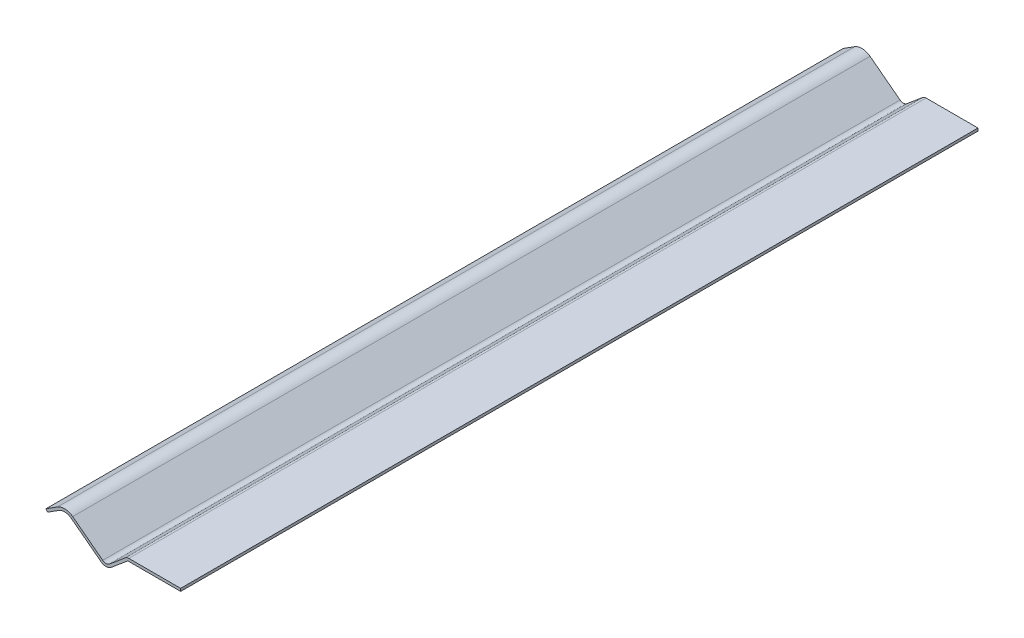
ISO-10303-21;
HEADER;
FILE_DESCRIPTION(('STEP AP214'),'2;1');
FILE_NAME('part.step','',(''),(''),'','','');
FILE_SCHEMA(('AUTOMOTIVE_DESIGN { 1 0 10303 214 1 1 1 1 }'));
ENDSEC;
DATA;
#1=APPLICATION_CONTEXT('core data for automotive mechanical design processes');
#2=APPLICATION_PROTOCOL_DEFINITION('international standard','automotive_design',2000,#1);
#3=PRODUCT_CONTEXT('',#1,'mechanical');
#4=PRODUCT('Part','Part','',(#3));
#5=PRODUCT_RELATED_PRODUCT_CATEGORY('part','',(#4));
#6=PRODUCT_DEFINITION_FORMATION('','',#4);
#7=PRODUCT_DEFINITION_CONTEXT('part definition',#1,'design');
#8=PRODUCT_DEFINITION('design','',#6,#7);
#9=PRODUCT_DEFINITION_SHAPE('','',#8);
#10=(LENGTH_UNIT() NAMED_UNIT(*) SI_UNIT(.MILLI.,.METRE.));
#11=(NAMED_UNIT(*) PLANE_ANGLE_UNIT() SI_UNIT($,.RADIAN.));
#12=(NAMED_UNIT(*) SI_UNIT($,.STERADIAN.) SOLID_ANGLE_UNIT());
#13=UNCERTAINTY_MEASURE_WITH_UNIT(LENGTH_MEASURE(1.E-05),#10,'distance_accuracy_value','');
#14=(GEOMETRIC_REPRESENTATION_CONTEXT(3) GLOBAL_UNCERTAINTY_ASSIGNED_CONTEXT((#13)) GLOBAL_UNIT_ASSIGNED_CONTEXT((#10,
#11,#12)) REPRESENTATION_CONTEXT('',''));
#15=CARTESIAN_POINT('',(0.,0.,0.));
#16=DIRECTION('',(0.,0.,1.));
#17=DIRECTION('',(1.,0.,0.));
#18=AXIS2_PLACEMENT_3D('',#15,#16,#17);
#19=CARTESIAN_POINT('',(-11.5501046787305,-0.477822668111692,74.));
#20=DIRECTION('',(0.,0.,-1.));
#21=DIRECTION('',(-1.,0.,0.));
#22=AXIS2_PLACEMENT_3D('',#19,#20,#21);
#23=CYLINDRICAL_SURFACE('',#22,2.5);
#24=CARTESIAN_POINT('',(-11.5501046787305,-0.477822668111692,-74.));
#25=DIRECTION('',(0.,0.,1.));
#26=DIRECTION('',(1.,0.,0.));
#27=AXIS2_PLACEMENT_3D('',#24,#25,#26);
#28=CIRCLE('',#27,2.5);
#29=CARTESIAN_POINT('',(-10.035554943505,1.51118188178971,-74.));
#30=VERTEX_POINT('',#29);
#31=CARTESIAN_POINT('',(-12.8883281895237,1.6338491423646,-74.));
#32=VERTEX_POINT('',#31);
#33=EDGE_CURVE('E180',#30,#32,#28,.T.);
#34=ORIENTED_EDGE('',*,*,#33,.T.);
#35=DIRECTION('',(0.,0.,-1.));
#36=VECTOR('',#35,1.);
#37=CARTESIAN_POINT('',(-12.8883281895237,1.6338491423646,74.));
#38=LINE('',#37,#36);
#39=CARTESIAN_POINT('',(-12.8883281895237,1.6338491423646,74.));
#40=VERTEX_POINT('',#39);
#41=EDGE_CURVE('E11',#40,#32,#38,.T.);
#42=ORIENTED_EDGE('',*,*,#41,.F.);
#43=CARTESIAN_POINT('',(-11.5501046787305,-0.477822668111692,74.));
#44=DIRECTION('',(0.,0.,1.));
#45=DIRECTION('',(1.,0.,0.));
#46=AXIS2_PLACEMENT_3D('',#43,#44,#45);
#47=CIRCLE('',#46,2.5);
#48=CARTESIAN_POINT('',(-10.035554943505,1.51118188178971,74.));
#49=VERTEX_POINT('',#48);
#50=EDGE_CURVE('E219',#49,#40,#47,.T.);
#51=ORIENTED_EDGE('',*,*,#50,.F.);
#52=DIRECTION('',(0.,0.,-1.));
#53=VECTOR('',#52,1.);
#54=CARTESIAN_POINT('',(-10.035554943505,1.51118188178971,74.));
#55=LINE('',#54,#53);
#56=EDGE_CURVE('E176',#49,#30,#55,.T.);
#57=ORIENTED_EDGE('',*,*,#56,.T.);
#58=EDGE_LOOP('',(#34,#42,#51,#57));
#59=FACE_BOUND('',#58,.T.);
#60=ADVANCED_FACE('F36',(#59),#23,.T.);
#61=CARTESIAN_POINT('',(-12.8883281895237,1.6338491423646,74.));
#62=DIRECTION('',(0.535289404317296,-0.844668724190516,0.));
#63=DIRECTION('',(0.844668724190516,0.535289404317296,0.));
#64=AXIS2_PLACEMENT_3D('',#61,#62,#63);
#65=PLANE('',#64);
#66=DIRECTION('',(-0.844668724190516,-0.535289404317296,0.));
#67=VECTOR('',#66,1.);
#68=CARTESIAN_POINT('',(-12.8883281895237,1.6338491423646,-74.));
#69=LINE('',#68,#67);
#70=CARTESIAN_POINT('',(-15.,0.29562563157136,-74.));
#71=VERTEX_POINT('',#70);
#72=EDGE_CURVE('E183',#32,#71,#69,.T.);
#73=ORIENTED_EDGE('',*,*,#72,.T.);
#74=DIRECTION('',(0.,0.,-1.));
#75=VECTOR('',#74,1.);
#76=CARTESIAN_POINT('',(-15.,0.29562563157136,74.));
#77=LINE('',#76,#75);
#78=CARTESIAN_POINT('',(-15.,0.29562563157136,74.));
#79=VERTEX_POINT('',#78);
#80=EDGE_CURVE('E44',#79,#71,#77,.T.);
#81=ORIENTED_EDGE('',*,*,#80,.F.);
#82=DIRECTION('',(-0.844668724190516,-0.535289404317296,0.));
#83=VECTOR('',#82,1.);
#84=CARTESIAN_POINT('',(-12.8883281895237,1.6338491423646,74.));
#85=LINE('',#84,#83);
#86=EDGE_CURVE('E119',#40,#79,#85,.T.);
#87=ORIENTED_EDGE('',*,*,#86,.F.);
#88=ORIENTED_EDGE('',*,*,#41,.T.);
#89=EDGE_LOOP('',(#73,#81,#87,#88));
#90=FACE_BOUND('',#89,.T.);
#91=ADVANCED_FACE('F311',(#90),#65,.F.);
#92=CARTESIAN_POINT('',(-15.,0.29562563157136,74.));
#93=DIRECTION('',(0.844668724190516,0.535289404317296,0.));
#94=DIRECTION('',(-0.535289404317296,0.844668724190516,0.));
#95=AXIS2_PLACEMENT_3D('',#92,#93,#94);
#96=PLANE('',#95);
#97=DIRECTION('',(0.535289404317296,-0.844668724190516,0.));
#98=VECTOR('',#97,1.);
#99=CARTESIAN_POINT('',(-15.,0.29562563157136,-74.));
#100=LINE('',#99,#98);
#101=CARTESIAN_POINT('',(-14.7323552978413,-0.126708730523898,-74.));
#102=VERTEX_POINT('',#101);
#103=EDGE_CURVE('E185',#71,#102,#100,.T.);
#104=ORIENTED_EDGE('',*,*,#103,.T.);
#105=DIRECTION('',(0.,0.,-1.));
#106=VECTOR('',#105,1.);
#107=CARTESIAN_POINT('',(-14.7323552978413,-0.126708730523898,74.));
#108=LINE('',#107,#106);
#109=CARTESIAN_POINT('',(-14.7323552978413,-0.126708730523898,74.));
#110=VERTEX_POINT('',#109);
#111=EDGE_CURVE('E242',#110,#102,#108,.T.);
#112=ORIENTED_EDGE('',*,*,#111,.F.);
#113=DIRECTION('',(0.535289404317296,-0.844668724190516,0.));
#114=VECTOR('',#113,1.);
#115=CARTESIAN_POINT('',(-15.,0.29562563157136,74.));
#116=LINE('',#115,#114);
#117=EDGE_CURVE('E249',#79,#110,#116,.T.);
#118=ORIENTED_EDGE('',*,*,#117,.F.);
#119=ORIENTED_EDGE('',*,*,#80,.T.);
#120=EDGE_LOOP('',(#104,#112,#118,#119));
#121=FACE_BOUND('',#120,.T.);
#122=ADVANCED_FACE('F247',(#121),#96,.F.);
#123=CARTESIAN_POINT('',(-12.6206834873651,1.21151478026934,74.));
#124=DIRECTION('',(0.535289404317297,-0.844668724190516,0.));
#125=DIRECTION('',(0.844668724190516,0.535289404317297,0.));
#126=AXIS2_PLACEMENT_3D('',#123,#124,#125);
#127=PLANE('',#126);
#128=DIRECTION('',(-0.844668724190516,-0.535289404317297,0.));
#129=VECTOR('',#128,1.);
#130=CARTESIAN_POINT('',(-12.6206834873651,1.21151478026934,-74.));
#131=LINE('',#130,#129);
#132=CARTESIAN_POINT('',(-12.6206834873651,1.21151478026934,-74.));
#133=VERTEX_POINT('',#132);
#134=EDGE_CURVE('E188',#133,#102,#131,.T.);
#135=ORIENTED_EDGE('',*,*,#134,.F.);
#136=DIRECTION('',(0.,0.,-1.));
#137=VECTOR('',#136,1.);
#138=CARTESIAN_POINT('',(-12.6206834873651,1.21151478026934,74.));
#139=LINE('',#138,#137);
#140=CARTESIAN_POINT('',(-12.6206834873651,1.21151478026934,74.));
#141=VERTEX_POINT('',#140);
#142=EDGE_CURVE('E240',#141,#133,#139,.T.);
#143=ORIENTED_EDGE('',*,*,#142,.F.);
#144=DIRECTION('',(-0.844668724190516,-0.535289404317297,0.));
#145=VECTOR('',#144,1.);
#146=CARTESIAN_POINT('',(-12.6206834873651,1.21151478026934,74.));
#147=LINE('',#146,#145);
#148=EDGE_CURVE('E259',#141,#110,#147,.T.);
#149=ORIENTED_EDGE('',*,*,#148,.T.);
#150=ORIENTED_EDGE('',*,*,#111,.T.);
#151=EDGE_LOOP('',(#135,#143,#149,#150));
#152=FACE_BOUND('',#151,.T.);
#153=ADVANCED_FACE('F256',(#152),#127,.T.);
#154=CARTESIAN_POINT('',(-11.5501046787305,-0.477822668111692,74.));
#155=DIRECTION('',(0.,0.,-1.));
#156=DIRECTION('',(-1.,0.,0.));
#157=AXIS2_PLACEMENT_3D('',#154,#155,#156);
#158=CYLINDRICAL_SURFACE('',#157,2.);
#159=CARTESIAN_POINT('',(-11.5501046787305,-0.477822668111692,-74.));
#160=DIRECTION('',(0.,0.,1.));
#161=DIRECTION('',(1.,0.,0.));
#162=AXIS2_PLACEMENT_3D('',#159,#160,#161);
#163=CIRCLE('',#162,2.);
#164=CARTESIAN_POINT('',(-10.3384648905501,1.11338097180943,-74.));
#165=VERTEX_POINT('',#164);
#166=EDGE_CURVE('E191',#165,#133,#163,.T.);
#167=ORIENTED_EDGE('',*,*,#166,.F.);
#168=DIRECTION('',(0.,0.,-1.));
#169=VECTOR('',#168,1.);
#170=CARTESIAN_POINT('',(-10.3384648905501,1.11338097180943,74.));
#171=LINE('',#170,#169);
#172=CARTESIAN_POINT('',(-10.3384648905501,1.11338097180943,74.));
#173=VERTEX_POINT('',#172);
#174=EDGE_CURVE('E238',#173,#165,#171,.T.);
#175=ORIENTED_EDGE('',*,*,#174,.F.);
#176=CARTESIAN_POINT('',(-11.5501046787305,-0.477822668111692,74.));
#177=DIRECTION('',(0.,0.,1.));
#178=DIRECTION('',(1.,0.,0.));
#179=AXIS2_PLACEMENT_3D('',#176,#177,#178);
#180=CIRCLE('',#179,2.);
#181=EDGE_CURVE('E262',#173,#141,#180,.T.);
#182=ORIENTED_EDGE('',*,*,#181,.T.);
#183=ORIENTED_EDGE('',*,*,#142,.T.);
#184=EDGE_LOOP('',(#167,#175,#182,#183));
#185=FACE_BOUND('',#184,.T.);
#186=ADVANCED_FACE('F322',(#185),#158,.F.);
#187=CARTESIAN_POINT('',(-4.76925215082618,-3.12735828682187,74.));
#188=DIRECTION('',(-0.605819894090186,-0.795601819960561,0.));
#189=DIRECTION('',(0.795601819960561,-0.605819894090186,0.));
#190=AXIS2_PLACEMENT_3D('',#187,#188,#189);
#191=PLANE('',#190);
#192=DIRECTION('',(-0.795601819960561,0.605819894090186,0.));
#193=VECTOR('',#192,1.);
#194=CARTESIAN_POINT('',(-4.76925215082618,-3.12735828682187,-74.));
#195=LINE('',#194,#193);
#196=CARTESIAN_POINT('',(-4.76925215082618,-3.12735828682187,-74.));
#197=VERTEX_POINT('',#196);
#198=EDGE_CURVE('E194',#197,#165,#195,.T.);
#199=ORIENTED_EDGE('',*,*,#198,.F.);
#200=DIRECTION('',(0.,0.,-1.));
#201=VECTOR('',#200,1.);
#202=CARTESIAN_POINT('',(-4.76925215082618,-3.12735828682187,74.));
#203=LINE('',#202,#201);
#204=CARTESIAN_POINT('',(-4.76925215082618,-3.12735828682187,74.));
#205=VERTEX_POINT('',#204);
#206=EDGE_CURVE('E236',#205,#197,#203,.T.);
#207=ORIENTED_EDGE('',*,*,#206,.F.);
#208=DIRECTION('',(-0.795601819960561,0.605819894090186,0.));
#209=VECTOR('',#208,1.);
#210=CARTESIAN_POINT('',(-4.76925215082618,-3.12735828682187,74.));
#211=LINE('',#210,#209);
#212=EDGE_CURVE('E264',#205,#173,#211,.T.);
#213=ORIENTED_EDGE('',*,*,#212,.T.);
#214=ORIENTED_EDGE('',*,*,#174,.T.);
#215=EDGE_LOOP('',(#199,#207,#213,#214));
#216=FACE_BOUND('',#215,.T.);
#217=ADVANCED_FACE('F325',(#216),#191,.T.);
#218=CARTESIAN_POINT('',(-3.8605223096909,-1.93395555688102,74.));
#219=DIRECTION('',(0.,0.,-1.));
#220=DIRECTION('',(-1.,0.,0.));
#221=AXIS2_PLACEMENT_3D('',#218,#219,#220);
#222=CYLINDRICAL_SURFACE('',#221,1.5);
#223=CARTESIAN_POINT('',(-3.8605223096909,-1.93395555688102,-74.));
#224=DIRECTION('',(0.,0.,-1.));
#225=DIRECTION('',(-1.,0.,0.));
#226=AXIS2_PLACEMENT_3D('',#223,#224,#225);
#227=CIRCLE('',#226,1.5);
#228=CARTESIAN_POINT('',(-2.89634089516109,-3.08302222155949,-74.));
#229=VERTEX_POINT('',#228);
#230=EDGE_CURVE('E197',#229,#197,#227,.T.);
#231=ORIENTED_EDGE('',*,*,#230,.F.);
#232=DIRECTION('',(0.,0.,-1.));
#233=VECTOR('',#232,1.);
#234=CARTESIAN_POINT('',(-2.89634089516109,-3.08302222155949,74.));
#235=LINE('',#234,#233);
#236=CARTESIAN_POINT('',(-2.89634089516109,-3.08302222155949,74.));
#237=VERTEX_POINT('',#236);
#238=EDGE_CURVE('E234',#237,#229,#235,.T.);
#239=ORIENTED_EDGE('',*,*,#238,.F.);
#240=CARTESIAN_POINT('',(-3.8605223096909,-1.93395555688102,74.));
#241=DIRECTION('',(0.,0.,-1.));
#242=DIRECTION('',(-1.,0.,0.));
#243=AXIS2_PLACEMENT_3D('',#240,#241,#242);
#244=CIRCLE('',#243,1.5);
#245=EDGE_CURVE('E271',#237,#205,#244,.T.);
#246=ORIENTED_EDGE('',*,*,#245,.T.);
#247=ORIENTED_EDGE('',*,*,#206,.T.);
#248=EDGE_LOOP('',(#231,#239,#246,#247));
#249=FACE_BOUND('',#248,.T.);
#250=ADVANCED_FACE('F329',(#249),#222,.T.);
#251=CARTESIAN_POINT('',(0.0425764294229316,-0.616977778440512,74.));
#252=DIRECTION('',(0.64278760968654,-0.766044443118977,0.));
#253=DIRECTION('',(0.766044443118977,0.64278760968654,0.));
#254=AXIS2_PLACEMENT_3D('',#251,#252,#253);
#255=PLANE('',#254);
#256=DIRECTION('',(-0.766044443118977,-0.64278760968654,0.));
#257=VECTOR('',#256,1.);
#258=CARTESIAN_POINT('',(0.0425764294229316,-0.616977778440512,-74.));
#259=LINE('',#258,#257);
#260=CARTESIAN_POINT('',(0.0425764294229316,-0.616977778440512,-74.));
#261=VERTEX_POINT('',#260);
#262=EDGE_CURVE('E200',#261,#229,#259,.T.);
#263=ORIENTED_EDGE('',*,*,#262,.F.);
#264=DIRECTION('',(0.,0.,-1.));
#265=VECTOR('',#264,1.);
#266=CARTESIAN_POINT('',(0.0425764294229316,-0.616977778440512,74.));
#267=LINE('',#266,#265);
#268=CARTESIAN_POINT('',(0.0425764294229316,-0.616977778440512,74.));
#269=VERTEX_POINT('',#268);
#270=EDGE_CURVE('E232',#269,#261,#267,.T.);
#271=ORIENTED_EDGE('',*,*,#270,.F.);
#272=DIRECTION('',(-0.766044443118977,-0.64278760968654,0.));
#273=VECTOR('',#272,1.);
#274=CARTESIAN_POINT('',(0.0425764294229316,-0.616977778440512,74.));
#275=LINE('',#274,#273);
#276=EDGE_CURVE('E274',#269,#237,#275,.T.);
#277=ORIENTED_EDGE('',*,*,#276,.T.);
#278=ORIENTED_EDGE('',*,*,#238,.T.);
#279=EDGE_LOOP('',(#263,#271,#277,#278));
#280=FACE_BOUND('',#279,.T.);
#281=ADVANCED_FACE('F333',(#280),#255,.T.);
#282=CARTESIAN_POINT('',(0.363970234266202,-1.,74.));
#283=DIRECTION('',(0.,0.,-1.));
#284=DIRECTION('',(-1.,0.,0.));
#285=AXIS2_PLACEMENT_3D('',#282,#283,#284);
#286=CYLINDRICAL_SURFACE('',#285,0.5);
#287=CARTESIAN_POINT('',(0.363970234266202,-1.,-74.));
#288=DIRECTION('',(0.,0.,1.));
#289=DIRECTION('',(1.,0.,0.));
#290=AXIS2_PLACEMENT_3D('',#287,#288,#289);
#291=CIRCLE('',#290,0.5);
#292=CARTESIAN_POINT('',(0.363970234266202,-0.500000000000001,-74.));
#293=VERTEX_POINT('',#292);
#294=EDGE_CURVE('E203',#293,#261,#291,.T.);
#295=ORIENTED_EDGE('',*,*,#294,.F.);
#296=DIRECTION('',(0.,0.,-1.));
#297=VECTOR('',#296,1.);
#298=CARTESIAN_POINT('',(0.363970234266202,-0.500000000000001,74.));
#299=LINE('',#298,#297);
#300=CARTESIAN_POINT('',(0.363970234266202,-0.500000000000001,74.));
#301=VERTEX_POINT('',#300);
#302=EDGE_CURVE('E230',#301,#293,#299,.T.);
#303=ORIENTED_EDGE('',*,*,#302,.F.);
#304=CARTESIAN_POINT('',(0.363970234266202,-1.,74.));
#305=DIRECTION('',(0.,0.,1.));
#306=DIRECTION('',(1.,0.,0.));
#307=AXIS2_PLACEMENT_3D('',#304,#305,#306);
#308=CIRCLE('',#307,0.5);
#309=EDGE_CURVE('E277',#301,#269,#308,.T.);
#310=ORIENTED_EDGE('',*,*,#309,.T.);
#311=ORIENTED_EDGE('',*,*,#270,.T.);
#312=EDGE_LOOP('',(#295,#303,#310,#311));
#313=FACE_BOUND('',#312,.T.);
#314=ADVANCED_FACE('F337',(#313),#286,.F.);
#315=CARTESIAN_POINT('',(10.,-0.5,74.));
#316=DIRECTION('',(0.,-1.,0.));
#317=DIRECTION('',(1.,0.,0.));
#318=AXIS2_PLACEMENT_3D('',#315,#316,#317);
#319=PLANE('',#318);
#320=DIRECTION('',(-1.,0.,0.));
#321=VECTOR('',#320,1.);
#322=CARTESIAN_POINT('',(10.,-0.5,-74.));
#323=LINE('',#322,#321);
#324=CARTESIAN_POINT('',(10.,-0.5,-74.));
#325=VERTEX_POINT('',#324);
#326=EDGE_CURVE('E206',#325,#293,#323,.T.);
#327=ORIENTED_EDGE('',*,*,#326,.F.);
#328=DIRECTION('',(0.,0.,-1.));
#329=VECTOR('',#328,1.);
#330=CARTESIAN_POINT('',(10.,-0.5,74.));
#331=LINE('',#330,#329);
#332=CARTESIAN_POINT('',(10.,-0.5,74.));
#333=VERTEX_POINT('',#332);
#334=EDGE_CURVE('E228',#333,#325,#331,.T.);
#335=ORIENTED_EDGE('',*,*,#334,.F.);
#336=DIRECTION('',(-1.,0.,0.));
#337=VECTOR('',#336,1.);
#338=CARTESIAN_POINT('',(10.,-0.5,74.));
#339=LINE('',#338,#337);
#340=EDGE_CURVE('E280',#333,#301,#339,.T.);
#341=ORIENTED_EDGE('',*,*,#340,.T.);
#342=ORIENTED_EDGE('',*,*,#302,.T.);
#343=EDGE_LOOP('',(#327,#335,#341,#342));
#344=FACE_BOUND('',#343,.T.);
#345=ADVANCED_FACE('F341',(#344),#319,.T.);
#346=CARTESIAN_POINT('',(10.,0.,74.));
#347=DIRECTION('',(1.,0.,0.));
#348=DIRECTION('',(0.,1.,0.));
#349=AXIS2_PLACEMENT_3D('',#346,#347,#348);
#350=PLANE('',#349);
#351=DIRECTION('',(0.,-1.,0.));
#352=VECTOR('',#351,1.);
#353=CARTESIAN_POINT('',(10.,0.,-74.));
#354=LINE('',#353,#352);
#355=CARTESIAN_POINT('',(10.,0.,-74.));
#356=VERTEX_POINT('',#355);
#357=EDGE_CURVE('E209',#356,#325,#354,.T.);
#358=ORIENTED_EDGE('',*,*,#357,.F.);
#359=DIRECTION('',(0.,0.,-1.));
#360=VECTOR('',#359,1.);
#361=CARTESIAN_POINT('',(10.,0.,74.));
#362=LINE('',#361,#360);
#363=CARTESIAN_POINT('',(10.,0.,74.));
#364=VERTEX_POINT('',#363);
#365=EDGE_CURVE('E226',#364,#356,#362,.T.);
#366=ORIENTED_EDGE('',*,*,#365,.F.);
#367=DIRECTION('',(0.,-1.,0.));
#368=VECTOR('',#367,1.);
#369=CARTESIAN_POINT('',(10.,0.,74.));
#370=LINE('',#369,#368);
#371=EDGE_CURVE('E283',#364,#333,#370,.T.);
#372=ORIENTED_EDGE('',*,*,#371,.T.);
#373=ORIENTED_EDGE('',*,*,#334,.T.);
#374=EDGE_LOOP('',(#358,#366,#372,#373));
#375=FACE_BOUND('',#374,.T.);
#376=ADVANCED_FACE('F345',(#375),#350,.T.);
#377=CARTESIAN_POINT('',(10.,0.,74.));
#378=DIRECTION('',(0.,-1.,0.));
#379=DIRECTION('',(1.,0.,0.));
#380=AXIS2_PLACEMENT_3D('',#377,#378,#379);
#381=PLANE('',#380);
#382=DIRECTION('',(-1.,0.,0.));
#383=VECTOR('',#382,1.);
#384=CARTESIAN_POINT('',(10.,0.,-74.));
#385=LINE('',#384,#383);
#386=CARTESIAN_POINT('',(0.363970234266202,0.,-74.));
#387=VERTEX_POINT('',#386);
#388=EDGE_CURVE('E212',#356,#387,#385,.T.);
#389=ORIENTED_EDGE('',*,*,#388,.T.);
#390=DIRECTION('',(0.,0.,-1.));
#391=VECTOR('',#390,1.);
#392=CARTESIAN_POINT('',(0.363970234266202,0.,74.));
#393=LINE('',#392,#391);
#394=CARTESIAN_POINT('',(0.363970234266202,0.,74.));
#395=VERTEX_POINT('',#394);
#396=EDGE_CURVE('E223',#395,#387,#393,.T.);
#397=ORIENTED_EDGE('',*,*,#396,.F.);
#398=DIRECTION('',(-1.,0.,0.));
#399=VECTOR('',#398,1.);
#400=CARTESIAN_POINT('',(10.,0.,74.));
#401=LINE('',#400,#399);
#402=EDGE_CURVE('E286',#364,#395,#401,.T.);
#403=ORIENTED_EDGE('',*,*,#402,.F.);
#404=ORIENTED_EDGE('',*,*,#365,.T.);
#405=EDGE_LOOP('',(#389,#397,#403,#404));
#406=FACE_BOUND('',#405,.T.);
#407=ADVANCED_FACE('F292',(#406),#381,.F.);
#408=CARTESIAN_POINT('',(0.363970234266202,-1.,74.));
#409=DIRECTION('',(0.,0.,-1.));
#410=DIRECTION('',(-1.,0.,0.));
#411=AXIS2_PLACEMENT_3D('',#408,#409,#410);
#412=CYLINDRICAL_SURFACE('',#411,1.);
#413=CARTESIAN_POINT('',(0.363970234266202,-1.,-74.));
#414=DIRECTION('',(0.,0.,1.));
#415=DIRECTION('',(1.,0.,0.));
#416=AXIS2_PLACEMENT_3D('',#413,#414,#415);
#417=CIRCLE('',#416,1.);
#418=CARTESIAN_POINT('',(-0.278817375420339,-0.233955556881024,-74.));
#419=VERTEX_POINT('',#418);
#420=EDGE_CURVE('E214',#387,#419,#417,.T.);
#421=ORIENTED_EDGE('',*,*,#420,.T.);
#422=DIRECTION('',(0.,0.,-1.));
#423=VECTOR('',#422,1.);
#424=CARTESIAN_POINT('',(-0.278817375420339,-0.233955556881024,74.));
#425=LINE('',#424,#423);
#426=CARTESIAN_POINT('',(-0.278817375420339,-0.233955556881024,74.));
#427=VERTEX_POINT('',#426);
#428=EDGE_CURVE('E171',#427,#419,#425,.T.);
#429=ORIENTED_EDGE('',*,*,#428,.F.);
#430=CARTESIAN_POINT('',(0.363970234266202,-1.,74.));
#431=DIRECTION('',(0.,0.,1.));
#432=DIRECTION('',(1.,0.,0.));
#433=AXIS2_PLACEMENT_3D('',#430,#431,#432);
#434=CIRCLE('',#433,1.);
#435=EDGE_CURVE('E162',#395,#427,#434,.T.);
#436=ORIENTED_EDGE('',*,*,#435,.F.);
#437=ORIENTED_EDGE('',*,*,#396,.T.);
#438=EDGE_LOOP('',(#421,#429,#436,#437));
#439=FACE_BOUND('',#438,.T.);
#440=ADVANCED_FACE('F296',(#439),#412,.T.);
#441=CARTESIAN_POINT('',(-0.278817375420339,-0.233955556881024,74.));
#442=DIRECTION('',(0.64278760968654,-0.766044443118977,0.));
#443=DIRECTION('',(0.766044443118977,0.64278760968654,0.));
#444=AXIS2_PLACEMENT_3D('',#441,#442,#443);
#445=PLANE('',#444);
#446=DIRECTION('',(-0.766044443118977,-0.64278760968654,0.));
#447=VECTOR('',#446,1.);
#448=CARTESIAN_POINT('',(-0.278817375420339,-0.233955556881024,-74.));
#449=LINE('',#448,#447);
#450=CARTESIAN_POINT('',(-3.21773470000436,-2.7,-74.));
#451=VERTEX_POINT('',#450);
#452=EDGE_CURVE('E170',#419,#451,#449,.T.);
#453=ORIENTED_EDGE('',*,*,#452,.T.);
#454=DIRECTION('',(0.,0.,-1.));
#455=VECTOR('',#454,1.);
#456=CARTESIAN_POINT('',(-3.21773470000436,-2.7,74.));
#457=LINE('',#456,#455);
#458=CARTESIAN_POINT('',(-3.21773470000436,-2.7,74.));
#459=VERTEX_POINT('',#458);
#460=EDGE_CURVE('E167',#459,#451,#457,.T.);
#461=ORIENTED_EDGE('',*,*,#460,.F.);
#462=DIRECTION('',(-0.766044443118977,-0.64278760968654,0.));
#463=VECTOR('',#462,1.);
#464=CARTESIAN_POINT('',(-0.278817375420339,-0.233955556881024,74.));
#465=LINE('',#464,#463);
#466=EDGE_CURVE('E156',#427,#459,#465,.T.);
#467=ORIENTED_EDGE('',*,*,#466,.F.);
#468=ORIENTED_EDGE('',*,*,#428,.T.);
#469=EDGE_LOOP('',(#453,#461,#467,#468));
#470=FACE_BOUND('',#469,.T.);
#471=ADVANCED_FACE('F168',(#470),#445,.F.);
#472=CARTESIAN_POINT('',(-3.8605223096909,-1.93395555688102,74.));
#473=DIRECTION('',(0.,0.,-1.));
#474=DIRECTION('',(-1.,0.,0.));
#475=AXIS2_PLACEMENT_3D('',#472,#473,#474);
#476=CYLINDRICAL_SURFACE('',#475,1.);
#477=CARTESIAN_POINT('',(-3.8605223096909,-1.93395555688102,-74.));
#478=DIRECTION('',(0.,0.,-1.));
#479=DIRECTION('',(-1.,0.,0.));
#480=AXIS2_PLACEMENT_3D('',#477,#478,#479);
#481=CIRCLE('',#480,1.);
#482=CARTESIAN_POINT('',(-4.46634220378108,-2.72955737684158,-74.));
#483=VERTEX_POINT('',#482);
#484=EDGE_CURVE('E105',#451,#483,#481,.T.);
#485=ORIENTED_EDGE('',*,*,#484,.T.);
#486=DIRECTION('',(0.,0.,-1.));
#487=VECTOR('',#486,1.);
#488=CARTESIAN_POINT('',(-4.46634220378108,-2.72955737684158,74.));
#489=LINE('',#488,#487);
#490=CARTESIAN_POINT('',(-4.46634220378108,-2.72955737684158,74.));
#491=VERTEX_POINT('',#490);
#492=EDGE_CURVE('E172',#491,#483,#489,.T.);
#493=ORIENTED_EDGE('',*,*,#492,.F.);
#494=CARTESIAN_POINT('',(-3.8605223096909,-1.93395555688102,74.));
#495=DIRECTION('',(0.,0.,-1.));
#496=DIRECTION('',(-1.,0.,0.));
#497=AXIS2_PLACEMENT_3D('',#494,#495,#496);
#498=CIRCLE('',#497,1.);
#499=EDGE_CURVE('E160',#459,#491,#498,.T.);
#500=ORIENTED_EDGE('',*,*,#499,.F.);
#501=ORIENTED_EDGE('',*,*,#460,.T.);
#502=EDGE_LOOP('',(#485,#493,#500,#501));
#503=FACE_BOUND('',#502,.T.);
#504=ADVANCED_FACE('F174',(#503),#476,.F.);
#505=CARTESIAN_POINT('',(-4.46634220378108,-2.72955737684158,74.));
#506=DIRECTION('',(-0.605819894090185,-0.795601819960561,0.));
#507=DIRECTION('',(0.795601819960561,-0.605819894090185,0.));
#508=AXIS2_PLACEMENT_3D('',#505,#506,#507);
#509=PLANE('',#508);
#510=DIRECTION('',(-0.795601819960561,0.605819894090185,0.));
#511=VECTOR('',#510,1.);
#512=CARTESIAN_POINT('',(-4.46634220378108,-2.72955737684158,-74.));
#513=LINE('',#512,#511);
#514=EDGE_CURVE('E111',#483,#30,#513,.T.);
#515=ORIENTED_EDGE('',*,*,#514,.T.);
#516=ORIENTED_EDGE('',*,*,#56,.F.);
#517=DIRECTION('',(-0.795601819960561,0.605819894090185,0.));
#518=VECTOR('',#517,1.);
#519=CARTESIAN_POINT('',(-4.46634220378108,-2.72955737684158,74.));
#520=LINE('',#519,#518);
#521=EDGE_CURVE('E52',#491,#49,#520,.T.);
#522=ORIENTED_EDGE('',*,*,#521,.F.);
#523=ORIENTED_EDGE('',*,*,#492,.T.);
#524=EDGE_LOOP('',(#515,#516,#522,#523));
#525=FACE_BOUND('',#524,.T.);
#526=ADVANCED_FACE('F300',(#525),#509,.F.);
#527=CARTESIAN_POINT('',(-11.5501046787305,-0.477822668111692,74.));
#528=DIRECTION('',(0.,0.,1.));
#529=DIRECTION('',(1.,0.,0.));
#530=AXIS2_PLACEMENT_3D('',#527,#528,#529);
#531=PLANE('',#530);
#532=ORIENTED_EDGE('',*,*,#50,.T.);
#533=ORIENTED_EDGE('',*,*,#86,.T.);
#534=ORIENTED_EDGE('',*,*,#117,.T.);
#535=ORIENTED_EDGE('',*,*,#148,.F.);
#536=ORIENTED_EDGE('',*,*,#181,.F.);
#537=ORIENTED_EDGE('',*,*,#212,.F.);
#538=ORIENTED_EDGE('',*,*,#245,.F.);
#539=ORIENTED_EDGE('',*,*,#276,.F.);
#540=ORIENTED_EDGE('',*,*,#309,.F.);
#541=ORIENTED_EDGE('',*,*,#340,.F.);
#542=ORIENTED_EDGE('',*,*,#371,.F.);
#543=ORIENTED_EDGE('',*,*,#402,.T.);
#544=ORIENTED_EDGE('',*,*,#435,.T.);
#545=ORIENTED_EDGE('',*,*,#466,.T.);
#546=ORIENTED_EDGE('',*,*,#499,.T.);
#547=ORIENTED_EDGE('',*,*,#521,.T.);
#548=EDGE_LOOP('',(#532,#533,#534,#535,#536,#537,#538,#539,#540,#541,#542,#543,#544,#545,#546,#547));
#549=FACE_BOUND('',#548,.T.);
#550=ADVANCED_FACE('F158',(#549),#531,.T.);
#551=CARTESIAN_POINT('',(-11.5501046787305,-0.477822668111692,-74.));
#552=DIRECTION('',(0.,0.,1.));
#553=DIRECTION('',(1.,0.,0.));
#554=AXIS2_PLACEMENT_3D('',#551,#552,#553);
#555=PLANE('',#554);
#556=ORIENTED_EDGE('',*,*,#33,.F.);
#557=ORIENTED_EDGE('',*,*,#514,.F.);
#558=ORIENTED_EDGE('',*,*,#484,.F.);
#559=ORIENTED_EDGE('',*,*,#452,.F.);
#560=ORIENTED_EDGE('',*,*,#420,.F.);
#561=ORIENTED_EDGE('',*,*,#388,.F.);
#562=ORIENTED_EDGE('',*,*,#357,.T.);
#563=ORIENTED_EDGE('',*,*,#326,.T.);
#564=ORIENTED_EDGE('',*,*,#294,.T.);
#565=ORIENTED_EDGE('',*,*,#262,.T.);
#566=ORIENTED_EDGE('',*,*,#230,.T.);
#567=ORIENTED_EDGE('',*,*,#198,.T.);
#568=ORIENTED_EDGE('',*,*,#166,.T.);
#569=ORIENTED_EDGE('',*,*,#134,.T.);
#570=ORIENTED_EDGE('',*,*,#103,.F.);
#571=ORIENTED_EDGE('',*,*,#72,.F.);
#572=EDGE_LOOP('',(#556,#557,#558,#559,#560,#561,#562,#563,#564,#565,#566,#567,#568,#569,#570,#571));
#573=FACE_BOUND('',#572,.T.);
#574=ADVANCED_FACE('F252',(#573),#555,.F.);
#575=CLOSED_SHELL('',(#60,#91,#122,#153,#186,#217,#250,#281,#314,#345,#376,#407,#440,#471,#504,
#526,#550,#574));
#576=MANIFOLD_SOLID_BREP('B2',#575);
#577=ADVANCED_BREP_SHAPE_REPRESENTATION('',(#18,#576),#14);
#578=SHAPE_DEFINITION_REPRESENTATION(#9,#577);
ENDSEC;
END-ISO-10303-21;
